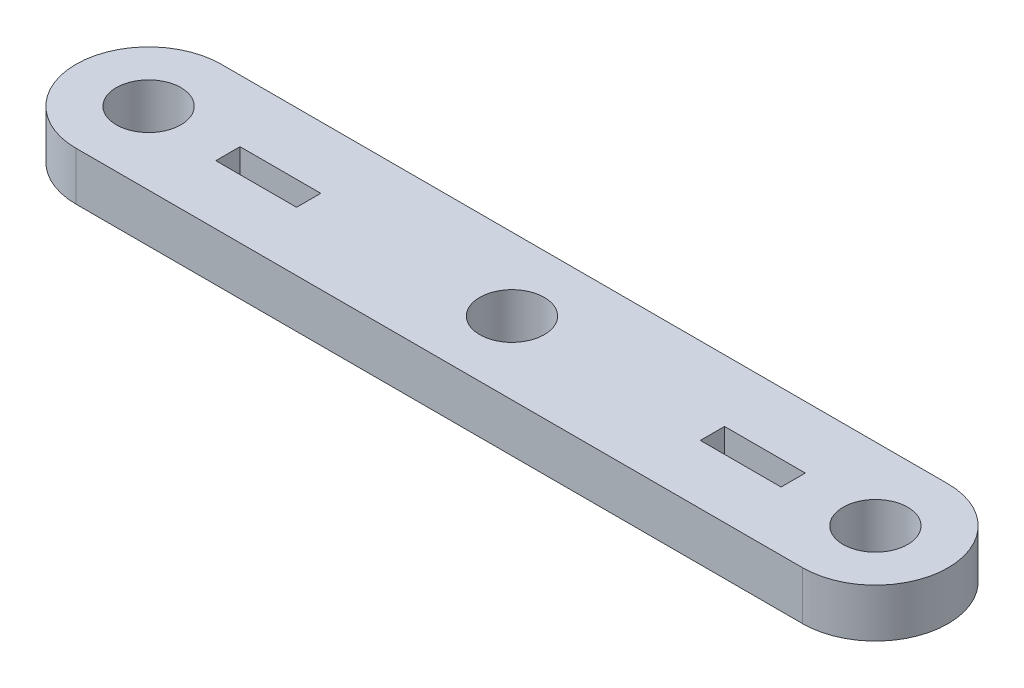
ISO-10303-21;
HEADER;
FILE_DESCRIPTION(('STEP AP214'),'2;1');
FILE_NAME('part.step','',(''),(''),'','','');
FILE_SCHEMA(('AUTOMOTIVE_DESIGN { 1 0 10303 214 1 1 1 1 }'));
ENDSEC;
DATA;
#1=APPLICATION_CONTEXT('core data for automotive mechanical design processes');
#2=APPLICATION_PROTOCOL_DEFINITION('international standard','automotive_design',2000,#1);
#3=PRODUCT_CONTEXT('',#1,'mechanical');
#4=PRODUCT('Part','Part','',(#3));
#5=PRODUCT_RELATED_PRODUCT_CATEGORY('part','',(#4));
#6=PRODUCT_DEFINITION_FORMATION('','',#4);
#7=PRODUCT_DEFINITION_CONTEXT('part definition',#1,'design');
#8=PRODUCT_DEFINITION('design','',#6,#7);
#9=PRODUCT_DEFINITION_SHAPE('','',#8);
#10=(LENGTH_UNIT() NAMED_UNIT(*) SI_UNIT(.MILLI.,.METRE.));
#11=(NAMED_UNIT(*) PLANE_ANGLE_UNIT() SI_UNIT($,.RADIAN.));
#12=(NAMED_UNIT(*) SI_UNIT($,.STERADIAN.) SOLID_ANGLE_UNIT());
#13=UNCERTAINTY_MEASURE_WITH_UNIT(LENGTH_MEASURE(1.E-05),#10,'distance_accuracy_value','');
#14=(GEOMETRIC_REPRESENTATION_CONTEXT(3) GLOBAL_UNCERTAINTY_ASSIGNED_CONTEXT((#13)) GLOBAL_UNIT_ASSIGNED_CONTEXT((#10,
#11,#12)) REPRESENTATION_CONTEXT('',''));
#15=CARTESIAN_POINT('',(0.,0.,0.));
#16=DIRECTION('',(0.,0.,1.));
#17=DIRECTION('',(1.,0.,0.));
#18=AXIS2_PLACEMENT_3D('',#15,#16,#17);
#19=CARTESIAN_POINT('',(0.,6.,-9.));
#20=DIRECTION('',(0.,-1.,0.));
#21=DIRECTION('',(0.,0.,-1.));
#22=AXIS2_PLACEMENT_3D('',#19,#20,#21);
#23=CYLINDRICAL_SURFACE('',#22,9.);
#24=CARTESIAN_POINT('',(0.,0.,-9.));
#25=DIRECTION('',(0.,1.,0.));
#26=DIRECTION('',(0.,0.,-1.));
#27=AXIS2_PLACEMENT_3D('',#24,#25,#26);
#28=CIRCLE('',#27,9.);
#29=CARTESIAN_POINT('',(0.,0.,-18.));
#30=VERTEX_POINT('',#29);
#31=CARTESIAN_POINT('',(0.,0.,0.));
#32=VERTEX_POINT('',#31);
#33=EDGE_CURVE('E234',#30,#32,#28,.T.);
#34=ORIENTED_EDGE('',*,*,#33,.T.);
#35=DIRECTION('',(0.,-1.,0.));
#36=VECTOR('',#35,1.);
#37=CARTESIAN_POINT('',(0.,6.,0.));
#38=LINE('',#37,#36);
#39=CARTESIAN_POINT('',(0.,6.,0.));
#40=VERTEX_POINT('',#39);
#41=EDGE_CURVE('E11',#40,#32,#38,.T.);
#42=ORIENTED_EDGE('',*,*,#41,.F.);
#43=CARTESIAN_POINT('',(0.,6.,-9.));
#44=DIRECTION('',(0.,1.,0.));
#45=DIRECTION('',(0.,0.,-1.));
#46=AXIS2_PLACEMENT_3D('',#43,#44,#45);
#47=CIRCLE('',#46,9.);
#48=CARTESIAN_POINT('',(0.,6.,-18.));
#49=VERTEX_POINT('',#48);
#50=EDGE_CURVE('E254',#49,#40,#47,.T.);
#51=ORIENTED_EDGE('',*,*,#50,.F.);
#52=DIRECTION('',(0.,-1.,0.));
#53=VECTOR('',#52,1.);
#54=CARTESIAN_POINT('',(0.,6.,-18.));
#55=LINE('',#54,#53);
#56=EDGE_CURVE('E268',#49,#30,#55,.T.);
#57=ORIENTED_EDGE('',*,*,#56,.T.);
#58=EDGE_LOOP('',(#34,#42,#51,#57));
#59=FACE_BOUND('',#58,.T.);
#60=ADVANCED_FACE('F47',(#59),#23,.T.);
#61=CARTESIAN_POINT('',(0.,6.,0.));
#62=DIRECTION('',(0.,0.,-1.));
#63=DIRECTION('',(-1.,0.,0.));
#64=AXIS2_PLACEMENT_3D('',#61,#62,#63);
#65=PLANE('',#64);
#66=DIRECTION('',(1.,0.,0.));
#67=VECTOR('',#66,1.);
#68=CARTESIAN_POINT('',(0.,0.,0.));
#69=LINE('',#68,#67);
#70=CARTESIAN_POINT('',(90.,0.,0.));
#71=VERTEX_POINT('',#70);
#72=EDGE_CURVE('E272',#32,#71,#69,.T.);
#73=ORIENTED_EDGE('',*,*,#72,.T.);
#74=DIRECTION('',(0.,-1.,0.));
#75=VECTOR('',#74,1.);
#76=CARTESIAN_POINT('',(90.,6.,0.));
#77=LINE('',#76,#75);
#78=CARTESIAN_POINT('',(90.,6.,0.));
#79=VERTEX_POINT('',#78);
#80=EDGE_CURVE('E55',#79,#71,#77,.T.);
#81=ORIENTED_EDGE('',*,*,#80,.F.);
#82=DIRECTION('',(1.,0.,0.));
#83=VECTOR('',#82,1.);
#84=CARTESIAN_POINT('',(0.,6.,0.));
#85=LINE('',#84,#83);
#86=EDGE_CURVE('E258',#40,#79,#85,.T.);
#87=ORIENTED_EDGE('',*,*,#86,.F.);
#88=ORIENTED_EDGE('',*,*,#41,.T.);
#89=EDGE_LOOP('',(#73,#81,#87,#88));
#90=FACE_BOUND('',#89,.T.);
#91=ADVANCED_FACE('F307',(#90),#65,.F.);
#92=CARTESIAN_POINT('',(90.,6.,-9.));
#93=DIRECTION('',(0.,-1.,0.));
#94=DIRECTION('',(0.,0.,-1.));
#95=AXIS2_PLACEMENT_3D('',#92,#93,#94);
#96=CYLINDRICAL_SURFACE('',#95,9.);
#97=CARTESIAN_POINT('',(90.,0.,-9.));
#98=DIRECTION('',(0.,1.,0.));
#99=DIRECTION('',(0.,0.,1.));
#100=AXIS2_PLACEMENT_3D('',#97,#98,#99);
#101=CIRCLE('',#100,9.);
#102=CARTESIAN_POINT('',(90.,0.,-18.));
#103=VERTEX_POINT('',#102);
#104=EDGE_CURVE('E275',#71,#103,#101,.T.);
#105=ORIENTED_EDGE('',*,*,#104,.T.);
#106=DIRECTION('',(0.,-1.,0.));
#107=VECTOR('',#106,1.);
#108=CARTESIAN_POINT('',(90.,6.,-18.));
#109=LINE('',#108,#107);
#110=CARTESIAN_POINT('',(90.,6.,-18.));
#111=VERTEX_POINT('',#110);
#112=EDGE_CURVE('E283',#111,#103,#109,.T.);
#113=ORIENTED_EDGE('',*,*,#112,.F.);
#114=CARTESIAN_POINT('',(90.,6.,-9.));
#115=DIRECTION('',(0.,1.,0.));
#116=DIRECTION('',(0.,0.,1.));
#117=AXIS2_PLACEMENT_3D('',#114,#115,#116);
#118=CIRCLE('',#117,9.);
#119=EDGE_CURVE('E262',#79,#111,#118,.T.);
#120=ORIENTED_EDGE('',*,*,#119,.F.);
#121=ORIENTED_EDGE('',*,*,#80,.T.);
#122=EDGE_LOOP('',(#105,#113,#120,#121));
#123=FACE_BOUND('',#122,.T.);
#124=ADVANCED_FACE('F292',(#123),#96,.T.);
#125=CARTESIAN_POINT('',(0.,6.,-18.));
#126=DIRECTION('',(0.,0.,1.));
#127=DIRECTION('',(1.,0.,0.));
#128=AXIS2_PLACEMENT_3D('',#125,#126,#127);
#129=PLANE('',#128);
#130=DIRECTION('',(-1.,0.,0.));
#131=VECTOR('',#130,1.);
#132=CARTESIAN_POINT('',(0.,0.,-18.));
#133=LINE('',#132,#131);
#134=EDGE_CURVE('E259',#103,#30,#133,.T.);
#135=ORIENTED_EDGE('',*,*,#134,.T.);
#136=ORIENTED_EDGE('',*,*,#56,.F.);
#137=DIRECTION('',(-1.,0.,0.));
#138=VECTOR('',#137,1.);
#139=CARTESIAN_POINT('',(0.,6.,-18.));
#140=LINE('',#139,#138);
#141=EDGE_CURVE('E265',#111,#49,#140,.T.);
#142=ORIENTED_EDGE('',*,*,#141,.F.);
#143=ORIENTED_EDGE('',*,*,#112,.T.);
#144=EDGE_LOOP('',(#135,#136,#142,#143));
#145=FACE_BOUND('',#144,.T.);
#146=ADVANCED_FACE('F300',(#145),#129,.F.);
#147=CARTESIAN_POINT('',(0.,6.,-9.));
#148=DIRECTION('',(0.,-1.,0.));
#149=DIRECTION('',(0.,0.,-1.));
#150=AXIS2_PLACEMENT_3D('',#147,#148,#149);
#151=PLANE('',#150);
#152=DIRECTION('',(1.,0.,0.));
#153=VECTOR('',#152,1.);
#154=CARTESIAN_POINT('',(10.,6.,-7.32125945255093));
#155=LINE('',#154,#153);
#156=CARTESIAN_POINT('',(10.,6.,-7.32125945255093));
#157=VERTEX_POINT('',#156);
#158=CARTESIAN_POINT('',(20.,6.,-7.32125945255093));
#159=VERTEX_POINT('',#158);
#160=EDGE_CURVE('E173',#157,#159,#155,.T.);
#161=ORIENTED_EDGE('',*,*,#160,.F.);
#162=DIRECTION('',(0.,0.,1.));
#163=VECTOR('',#162,1.);
#164=CARTESIAN_POINT('',(10.,6.,-10.3212594525509));
#165=LINE('',#164,#163);
#166=CARTESIAN_POINT('',(10.,6.,-10.3212594525509));
#167=VERTEX_POINT('',#166);
#168=EDGE_CURVE('E62',#167,#157,#165,.T.);
#169=ORIENTED_EDGE('',*,*,#168,.F.);
#170=DIRECTION('',(-1.,0.,0.));
#171=VECTOR('',#170,1.);
#172=CARTESIAN_POINT('',(10.,6.,-10.3212594525509));
#173=LINE('',#172,#171);
#174=CARTESIAN_POINT('',(20.,6.,-10.3212594525509));
#175=VERTEX_POINT('',#174);
#176=EDGE_CURVE('E160',#175,#167,#173,.T.);
#177=ORIENTED_EDGE('',*,*,#176,.F.);
#178=DIRECTION('',(0.,0.,-1.));
#179=VECTOR('',#178,1.);
#180=CARTESIAN_POINT('',(20.,6.,-10.3212594525509));
#181=LINE('',#180,#179);
#182=EDGE_CURVE('E164',#159,#175,#181,.T.);
#183=ORIENTED_EDGE('',*,*,#182,.F.);
#184=EDGE_LOOP('',(#161,#169,#177,#183));
#185=FACE_BOUND('',#184,.T.);
#186=DIRECTION('',(-1.,0.,0.));
#187=VECTOR('',#186,1.);
#188=CARTESIAN_POINT('',(80.,6.,-10.3212594525508));
#189=LINE('',#188,#187);
#190=CARTESIAN_POINT('',(80.,6.,-10.3212594525508));
#191=VERTEX_POINT('',#190);
#192=CARTESIAN_POINT('',(70.,6.,-10.3212594525509));
#193=VERTEX_POINT('',#192);
#194=EDGE_CURVE('E210',#191,#193,#189,.T.);
#195=ORIENTED_EDGE('',*,*,#194,.F.);
#196=DIRECTION('',(0.,0.,-1.));
#197=VECTOR('',#196,1.);
#198=CARTESIAN_POINT('',(80.,6.,-10.3212594525508));
#199=LINE('',#198,#197);
#200=CARTESIAN_POINT('',(80.,6.,-7.32125945255083));
#201=VERTEX_POINT('',#200);
#202=EDGE_CURVE('E70',#201,#191,#199,.T.);
#203=ORIENTED_EDGE('',*,*,#202,.F.);
#204=DIRECTION('',(1.,0.,0.));
#205=VECTOR('',#204,1.);
#206=CARTESIAN_POINT('',(80.,6.,-7.32125945255083));
#207=LINE('',#206,#205);
#208=CARTESIAN_POINT('',(70.,6.,-7.32125945255086));
#209=VERTEX_POINT('',#208);
#210=EDGE_CURVE('E201',#209,#201,#207,.T.);
#211=ORIENTED_EDGE('',*,*,#210,.F.);
#212=DIRECTION('',(0.,0.,1.));
#213=VECTOR('',#212,1.);
#214=CARTESIAN_POINT('',(70.,6.,-10.3212594525509));
#215=LINE('',#214,#213);
#216=EDGE_CURVE('E205',#193,#209,#215,.T.);
#217=ORIENTED_EDGE('',*,*,#216,.F.);
#218=EDGE_LOOP('',(#195,#203,#211,#217));
#219=FACE_BOUND('',#218,.T.);
#220=CARTESIAN_POINT('',(0.,6.,-9.));
#221=DIRECTION('',(0.,-1.,0.));
#222=DIRECTION('',(0.,0.,-1.));
#223=AXIS2_PLACEMENT_3D('',#220,#221,#222);
#224=CIRCLE('',#223,4.);
#225=CARTESIAN_POINT('',(0.,6.,-13.));
#226=VERTEX_POINT('',#225);
#227=EDGE_CURVE('E230',#226,#226,#224,.T.);
#228=ORIENTED_EDGE('',*,*,#227,.T.);
#229=EDGE_LOOP('',(#228));
#230=FACE_BOUND('',#229,.T.);
#231=CARTESIAN_POINT('',(45.,6.,-8.99999999999999));
#232=DIRECTION('',(0.,-1.,0.));
#233=DIRECTION('',(0.,0.,-1.));
#234=AXIS2_PLACEMENT_3D('',#231,#232,#233);
#235=CIRCLE('',#234,4.00000000000001);
#236=CARTESIAN_POINT('',(45.,6.,-13.));
#237=VERTEX_POINT('',#236);
#238=EDGE_CURVE('E243',#237,#237,#235,.T.);
#239=ORIENTED_EDGE('',*,*,#238,.T.);
#240=EDGE_LOOP('',(#239));
#241=FACE_BOUND('',#240,.T.);
#242=CARTESIAN_POINT('',(90.,6.,-8.99999999999999));
#243=DIRECTION('',(0.,-1.,0.));
#244=DIRECTION('',(0.,0.,1.));
#245=AXIS2_PLACEMENT_3D('',#242,#243,#244);
#246=CIRCLE('',#245,4.00000000000001);
#247=CARTESIAN_POINT('',(90.,6.,-4.99999999999998));
#248=VERTEX_POINT('',#247);
#249=EDGE_CURVE('E182',#248,#248,#246,.T.);
#250=ORIENTED_EDGE('',*,*,#249,.T.);
#251=EDGE_LOOP('',(#250));
#252=FACE_BOUND('',#251,.T.);
#253=ORIENTED_EDGE('',*,*,#50,.T.);
#254=ORIENTED_EDGE('',*,*,#86,.T.);
#255=ORIENTED_EDGE('',*,*,#119,.T.);
#256=ORIENTED_EDGE('',*,*,#141,.T.);
#257=EDGE_LOOP('',(#253,#254,#255,#256));
#258=FACE_BOUND('',#257,.T.);
#259=ADVANCED_FACE('F306',(#185,#219,#230,#241,#252,#258),#151,.F.);
#260=CARTESIAN_POINT('',(0.,0.,-9.));
#261=DIRECTION('',(0.,-1.,0.));
#262=DIRECTION('',(0.,0.,-1.));
#263=AXIS2_PLACEMENT_3D('',#260,#261,#262);
#264=PLANE('',#263);
#265=DIRECTION('',(0.,0.,1.));
#266=VECTOR('',#265,1.);
#267=CARTESIAN_POINT('',(10.,0.,-10.3212594525509));
#268=LINE('',#267,#266);
#269=CARTESIAN_POINT('',(10.,0.,-10.3212594525509));
#270=VERTEX_POINT('',#269);
#271=CARTESIAN_POINT('',(10.,0.,-7.32125945255093));
#272=VERTEX_POINT('',#271);
#273=EDGE_CURVE('E138',#270,#272,#268,.T.);
#274=ORIENTED_EDGE('',*,*,#273,.T.);
#275=DIRECTION('',(1.,0.,0.));
#276=VECTOR('',#275,1.);
#277=CARTESIAN_POINT('',(10.,0.,-7.32125945255093));
#278=LINE('',#277,#276);
#279=CARTESIAN_POINT('',(20.,0.,-7.32125945255093));
#280=VERTEX_POINT('',#279);
#281=EDGE_CURVE('E149',#272,#280,#278,.T.);
#282=ORIENTED_EDGE('',*,*,#281,.T.);
#283=DIRECTION('',(0.,0.,-1.));
#284=VECTOR('',#283,1.);
#285=CARTESIAN_POINT('',(20.,0.,-10.3212594525509));
#286=LINE('',#285,#284);
#287=CARTESIAN_POINT('',(20.,0.,-10.3212594525509));
#288=VERTEX_POINT('',#287);
#289=EDGE_CURVE('E154',#280,#288,#286,.T.);
#290=ORIENTED_EDGE('',*,*,#289,.T.);
#291=DIRECTION('',(-1.,0.,0.));
#292=VECTOR('',#291,1.);
#293=CARTESIAN_POINT('',(10.,0.,-10.3212594525509));
#294=LINE('',#293,#292);
#295=EDGE_CURVE('E145',#288,#270,#294,.T.);
#296=ORIENTED_EDGE('',*,*,#295,.T.);
#297=EDGE_LOOP('',(#274,#282,#290,#296));
#298=FACE_BOUND('',#297,.T.);
#299=DIRECTION('',(0.,0.,-1.));
#300=VECTOR('',#299,1.);
#301=CARTESIAN_POINT('',(80.,0.,-10.3212594525508));
#302=LINE('',#301,#300);
#303=CARTESIAN_POINT('',(80.,0.,-7.32125945255083));
#304=VERTEX_POINT('',#303);
#305=CARTESIAN_POINT('',(80.,0.,-10.3212594525508));
#306=VERTEX_POINT('',#305);
#307=EDGE_CURVE('E206',#304,#306,#302,.T.);
#308=ORIENTED_EDGE('',*,*,#307,.T.);
#309=DIRECTION('',(-1.,0.,0.));
#310=VECTOR('',#309,1.);
#311=CARTESIAN_POINT('',(80.,0.,-10.3212594525508));
#312=LINE('',#311,#310);
#313=CARTESIAN_POINT('',(70.,0.,-10.3212594525509));
#314=VERTEX_POINT('',#313);
#315=EDGE_CURVE('E223',#306,#314,#312,.T.);
#316=ORIENTED_EDGE('',*,*,#315,.T.);
#317=DIRECTION('',(0.,0.,1.));
#318=VECTOR('',#317,1.);
#319=CARTESIAN_POINT('',(70.,0.,-10.3212594525509));
#320=LINE('',#319,#318);
#321=CARTESIAN_POINT('',(70.,0.,-7.32125945255086));
#322=VERTEX_POINT('',#321);
#323=EDGE_CURVE('E219',#314,#322,#320,.T.);
#324=ORIENTED_EDGE('',*,*,#323,.T.);
#325=DIRECTION('',(1.,0.,0.));
#326=VECTOR('',#325,1.);
#327=CARTESIAN_POINT('',(80.,0.,-7.32125945255083));
#328=LINE('',#327,#326);
#329=EDGE_CURVE('E191',#322,#304,#328,.T.);
#330=ORIENTED_EDGE('',*,*,#329,.T.);
#331=EDGE_LOOP('',(#308,#316,#324,#330));
#332=FACE_BOUND('',#331,.T.);
#333=CARTESIAN_POINT('',(0.,0.,-9.));
#334=DIRECTION('',(0.,-1.,0.));
#335=DIRECTION('',(0.,0.,-1.));
#336=AXIS2_PLACEMENT_3D('',#333,#334,#335);
#337=CIRCLE('',#336,4.);
#338=CARTESIAN_POINT('',(0.,0.,-13.));
#339=VERTEX_POINT('',#338);
#340=EDGE_CURVE('E235',#339,#339,#337,.T.);
#341=ORIENTED_EDGE('',*,*,#340,.F.);
#342=EDGE_LOOP('',(#341));
#343=FACE_BOUND('',#342,.T.);
#344=CARTESIAN_POINT('',(45.,0.,-8.99999999999999));
#345=DIRECTION('',(0.,-1.,0.));
#346=DIRECTION('',(0.,0.,-1.));
#347=AXIS2_PLACEMENT_3D('',#344,#345,#346);
#348=CIRCLE('',#347,4.00000000000001);
#349=CARTESIAN_POINT('',(45.,0.,-13.));
#350=VERTEX_POINT('',#349);
#351=EDGE_CURVE('E239',#350,#350,#348,.T.);
#352=ORIENTED_EDGE('',*,*,#351,.F.);
#353=EDGE_LOOP('',(#352));
#354=FACE_BOUND('',#353,.T.);
#355=CARTESIAN_POINT('',(90.,0.,-8.99999999999999));
#356=DIRECTION('',(0.,-1.,0.));
#357=DIRECTION('',(0.,0.,1.));
#358=AXIS2_PLACEMENT_3D('',#355,#356,#357);
#359=CIRCLE('',#358,4.00000000000001);
#360=CARTESIAN_POINT('',(90.,0.,-4.99999999999998));
#361=VERTEX_POINT('',#360);
#362=EDGE_CURVE('E247',#361,#361,#359,.T.);
#363=ORIENTED_EDGE('',*,*,#362,.F.);
#364=EDGE_LOOP('',(#363));
#365=FACE_BOUND('',#364,.T.);
#366=ORIENTED_EDGE('',*,*,#33,.F.);
#367=ORIENTED_EDGE('',*,*,#134,.F.);
#368=ORIENTED_EDGE('',*,*,#104,.F.);
#369=ORIENTED_EDGE('',*,*,#72,.F.);
#370=EDGE_LOOP('',(#366,#367,#368,#369));
#371=FACE_BOUND('',#370,.T.);
#372=ADVANCED_FACE('F156',(#298,#332,#343,#354,#365,#371),#264,.T.);
#373=CARTESIAN_POINT('',(90.,6.,-8.99999999999999));
#374=DIRECTION('',(0.,-1.,0.));
#375=DIRECTION('',(0.,0.,-1.));
#376=AXIS2_PLACEMENT_3D('',#373,#374,#375);
#377=CYLINDRICAL_SURFACE('',#376,4.00000000000001);
#378=ORIENTED_EDGE('',*,*,#249,.F.);
#379=EDGE_LOOP('',(#378));
#380=FACE_BOUND('',#379,.T.);
#381=ORIENTED_EDGE('',*,*,#362,.T.);
#382=EDGE_LOOP('',(#381));
#383=FACE_BOUND('',#382,.T.);
#384=ADVANCED_FACE('F319',(#380,#383),#377,.F.);
#385=CARTESIAN_POINT('',(45.,6.,-8.99999999999999));
#386=DIRECTION('',(0.,-1.,0.));
#387=DIRECTION('',(0.,0.,-1.));
#388=AXIS2_PLACEMENT_3D('',#385,#386,#387);
#389=CYLINDRICAL_SURFACE('',#388,4.00000000000001);
#390=ORIENTED_EDGE('',*,*,#238,.F.);
#391=EDGE_LOOP('',(#390));
#392=FACE_BOUND('',#391,.T.);
#393=ORIENTED_EDGE('',*,*,#351,.T.);
#394=EDGE_LOOP('',(#393));
#395=FACE_BOUND('',#394,.T.);
#396=ADVANCED_FACE('F325',(#392,#395),#389,.F.);
#397=CARTESIAN_POINT('',(0.,6.,-9.));
#398=DIRECTION('',(0.,-1.,0.));
#399=DIRECTION('',(0.,0.,-1.));
#400=AXIS2_PLACEMENT_3D('',#397,#398,#399);
#401=CYLINDRICAL_SURFACE('',#400,4.);
#402=ORIENTED_EDGE('',*,*,#227,.F.);
#403=EDGE_LOOP('',(#402));
#404=FACE_BOUND('',#403,.T.);
#405=ORIENTED_EDGE('',*,*,#340,.T.);
#406=EDGE_LOOP('',(#405));
#407=FACE_BOUND('',#406,.T.);
#408=ADVANCED_FACE('F329',(#404,#407),#401,.F.);
#409=CARTESIAN_POINT('',(80.,0.,-10.3212594525508));
#410=DIRECTION('',(1.,0.,0.));
#411=DIRECTION('',(0.,0.,-1.));
#412=AXIS2_PLACEMENT_3D('',#409,#410,#411);
#413=PLANE('',#412);
#414=ORIENTED_EDGE('',*,*,#202,.T.);
#415=DIRECTION('',(0.,1.,0.));
#416=VECTOR('',#415,1.);
#417=CARTESIAN_POINT('',(80.,0.,-10.3212594525508));
#418=LINE('',#417,#416);
#419=EDGE_CURVE('E188',#306,#191,#418,.T.);
#420=ORIENTED_EDGE('',*,*,#419,.F.);
#421=ORIENTED_EDGE('',*,*,#307,.F.);
#422=DIRECTION('',(0.,1.,0.));
#423=VECTOR('',#422,1.);
#424=CARTESIAN_POINT('',(80.,0.,-7.32125945255083));
#425=LINE('',#424,#423);
#426=EDGE_CURVE('E198',#304,#201,#425,.T.);
#427=ORIENTED_EDGE('',*,*,#426,.T.);
#428=EDGE_LOOP('',(#414,#420,#421,#427));
#429=FACE_BOUND('',#428,.T.);
#430=ADVANCED_FACE('F333',(#429),#413,.F.);
#431=CARTESIAN_POINT('',(80.,0.,-7.32125945255083));
#432=DIRECTION('',(0.,0.,1.));
#433=DIRECTION('',(1.,0.,0.));
#434=AXIS2_PLACEMENT_3D('',#431,#432,#433);
#435=PLANE('',#434);
#436=ORIENTED_EDGE('',*,*,#210,.T.);
#437=ORIENTED_EDGE('',*,*,#426,.F.);
#438=ORIENTED_EDGE('',*,*,#329,.F.);
#439=DIRECTION('',(0.,1.,0.));
#440=VECTOR('',#439,1.);
#441=CARTESIAN_POINT('',(70.,0.,-7.32125945255086));
#442=LINE('',#441,#440);
#443=EDGE_CURVE('E195',#322,#209,#442,.T.);
#444=ORIENTED_EDGE('',*,*,#443,.T.);
#445=EDGE_LOOP('',(#436,#437,#438,#444));
#446=FACE_BOUND('',#445,.T.);
#447=ADVANCED_FACE('F335',(#446),#435,.F.);
#448=CARTESIAN_POINT('',(70.,0.,-10.3212594525509));
#449=DIRECTION('',(-1.,0.,0.));
#450=DIRECTION('',(0.,0.,1.));
#451=AXIS2_PLACEMENT_3D('',#448,#449,#450);
#452=PLANE('',#451);
#453=ORIENTED_EDGE('',*,*,#216,.T.);
#454=ORIENTED_EDGE('',*,*,#443,.F.);
#455=ORIENTED_EDGE('',*,*,#323,.F.);
#456=DIRECTION('',(0.,1.,0.));
#457=VECTOR('',#456,1.);
#458=CARTESIAN_POINT('',(70.,0.,-10.3212594525509));
#459=LINE('',#458,#457);
#460=EDGE_CURVE('E192',#314,#193,#459,.T.);
#461=ORIENTED_EDGE('',*,*,#460,.T.);
#462=EDGE_LOOP('',(#453,#454,#455,#461));
#463=FACE_BOUND('',#462,.T.);
#464=ADVANCED_FACE('F338',(#463),#452,.F.);
#465=CARTESIAN_POINT('',(80.,0.,-10.3212594525508));
#466=DIRECTION('',(0.,0.,-1.));
#467=DIRECTION('',(-1.,0.,0.));
#468=AXIS2_PLACEMENT_3D('',#465,#466,#467);
#469=PLANE('',#468);
#470=ORIENTED_EDGE('',*,*,#194,.T.);
#471=ORIENTED_EDGE('',*,*,#460,.F.);
#472=ORIENTED_EDGE('',*,*,#315,.F.);
#473=ORIENTED_EDGE('',*,*,#419,.T.);
#474=EDGE_LOOP('',(#470,#471,#472,#473));
#475=FACE_BOUND('',#474,.T.);
#476=ADVANCED_FACE('F342',(#475),#469,.F.);
#477=CARTESIAN_POINT('',(10.,0.,-10.3212594525509));
#478=DIRECTION('',(-1.,0.,0.));
#479=DIRECTION('',(0.,0.,1.));
#480=AXIS2_PLACEMENT_3D('',#477,#478,#479);
#481=PLANE('',#480);
#482=ORIENTED_EDGE('',*,*,#168,.T.);
#483=DIRECTION('',(0.,1.,0.));
#484=VECTOR('',#483,1.);
#485=CARTESIAN_POINT('',(10.,0.,-7.32125945255093));
#486=LINE('',#485,#484);
#487=EDGE_CURVE('E134',#272,#157,#486,.T.);
#488=ORIENTED_EDGE('',*,*,#487,.F.);
#489=ORIENTED_EDGE('',*,*,#273,.F.);
#490=DIRECTION('',(0.,1.,0.));
#491=VECTOR('',#490,1.);
#492=CARTESIAN_POINT('',(10.,0.,-10.3212594525509));
#493=LINE('',#492,#491);
#494=EDGE_CURVE('E179',#270,#167,#493,.T.);
#495=ORIENTED_EDGE('',*,*,#494,.T.);
#496=EDGE_LOOP('',(#482,#488,#489,#495));
#497=FACE_BOUND('',#496,.T.);
#498=ADVANCED_FACE('F136',(#497),#481,.F.);
#499=CARTESIAN_POINT('',(10.,0.,-10.3212594525509));
#500=DIRECTION('',(0.,0.,-1.));
#501=DIRECTION('',(-1.,0.,0.));
#502=AXIS2_PLACEMENT_3D('',#499,#500,#501);
#503=PLANE('',#502);
#504=ORIENTED_EDGE('',*,*,#176,.T.);
#505=ORIENTED_EDGE('',*,*,#494,.F.);
#506=ORIENTED_EDGE('',*,*,#295,.F.);
#507=DIRECTION('',(0.,1.,0.));
#508=VECTOR('',#507,1.);
#509=CARTESIAN_POINT('',(20.,0.,-10.3212594525509));
#510=LINE('',#509,#508);
#511=EDGE_CURVE('E183',#288,#175,#510,.T.);
#512=ORIENTED_EDGE('',*,*,#511,.T.);
#513=EDGE_LOOP('',(#504,#505,#506,#512));
#514=FACE_BOUND('',#513,.T.);
#515=ADVANCED_FACE('F351',(#514),#503,.F.);
#516=CARTESIAN_POINT('',(20.,0.,-10.3212594525509));
#517=DIRECTION('',(1.,0.,0.));
#518=DIRECTION('',(0.,0.,-1.));
#519=AXIS2_PLACEMENT_3D('',#516,#517,#518);
#520=PLANE('',#519);
#521=ORIENTED_EDGE('',*,*,#182,.T.);
#522=ORIENTED_EDGE('',*,*,#511,.F.);
#523=ORIENTED_EDGE('',*,*,#289,.F.);
#524=DIRECTION('',(0.,1.,0.));
#525=VECTOR('',#524,1.);
#526=CARTESIAN_POINT('',(20.,0.,-7.32125945255093));
#527=LINE('',#526,#525);
#528=EDGE_CURVE('E144',#280,#159,#527,.T.);
#529=ORIENTED_EDGE('',*,*,#528,.T.);
#530=EDGE_LOOP('',(#521,#522,#523,#529));
#531=FACE_BOUND('',#530,.T.);
#532=ADVANCED_FACE('F354',(#531),#520,.F.);
#533=CARTESIAN_POINT('',(10.,0.,-7.32125945255093));
#534=DIRECTION('',(0.,0.,1.));
#535=DIRECTION('',(1.,0.,0.));
#536=AXIS2_PLACEMENT_3D('',#533,#534,#535);
#537=PLANE('',#536);
#538=ORIENTED_EDGE('',*,*,#160,.T.);
#539=ORIENTED_EDGE('',*,*,#528,.F.);
#540=ORIENTED_EDGE('',*,*,#281,.F.);
#541=ORIENTED_EDGE('',*,*,#487,.T.);
#542=EDGE_LOOP('',(#538,#539,#540,#541));
#543=FACE_BOUND('',#542,.T.);
#544=ADVANCED_FACE('F150',(#543),#537,.F.);
#545=CLOSED_SHELL('',(#60,#91,#124,#146,#259,#372,#384,#396,#408,#430,#447,#464,#476,#498,#515,
#532,#544));
#546=MANIFOLD_SOLID_BREP('B2',#545);
#547=ADVANCED_BREP_SHAPE_REPRESENTATION('',(#18,#546),#14);
#548=SHAPE_DEFINITION_REPRESENTATION(#9,#547);
ENDSEC;
END-ISO-10303-21;
